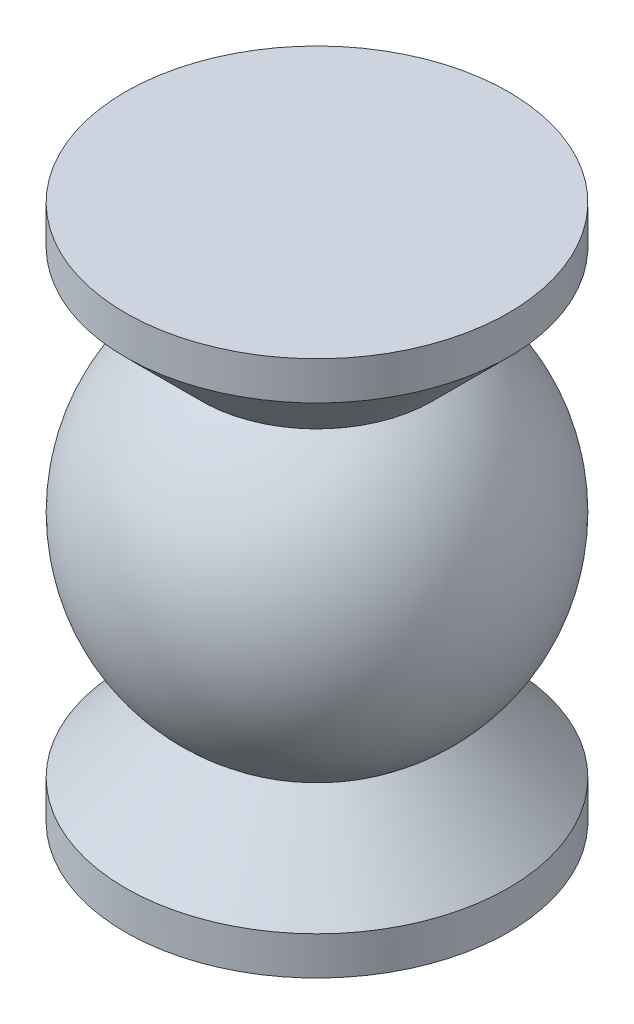
ISO-10303-21;
HEADER;
FILE_DESCRIPTION(('STEP AP214'),'2;1');
FILE_NAME('part.step','',(''),(''),'','','');
FILE_SCHEMA(('AUTOMOTIVE_DESIGN { 1 0 10303 214 1 1 1 1 }'));
ENDSEC;
DATA;
#1=APPLICATION_CONTEXT('core data for automotive mechanical design processes');
#2=APPLICATION_PROTOCOL_DEFINITION('international standard','automotive_design',2000,#1);
#3=PRODUCT_CONTEXT('',#1,'mechanical');
#4=PRODUCT('Part','Part','',(#3));
#5=PRODUCT_RELATED_PRODUCT_CATEGORY('part','',(#4));
#6=PRODUCT_DEFINITION_FORMATION('','',#4);
#7=PRODUCT_DEFINITION_CONTEXT('part definition',#1,'design');
#8=PRODUCT_DEFINITION('design','',#6,#7);
#9=PRODUCT_DEFINITION_SHAPE('','',#8);
#10=(LENGTH_UNIT() NAMED_UNIT(*) SI_UNIT(.MILLI.,.METRE.));
#11=(NAMED_UNIT(*) PLANE_ANGLE_UNIT() SI_UNIT($,.RADIAN.));
#12=(NAMED_UNIT(*) SI_UNIT($,.STERADIAN.) SOLID_ANGLE_UNIT());
#13=UNCERTAINTY_MEASURE_WITH_UNIT(LENGTH_MEASURE(1.E-05),#10,'distance_accuracy_value','');
#14=(GEOMETRIC_REPRESENTATION_CONTEXT(3) GLOBAL_UNCERTAINTY_ASSIGNED_CONTEXT((#13)) GLOBAL_UNIT_ASSIGNED_CONTEXT((#10,
#11,#12)) REPRESENTATION_CONTEXT('',''));
#15=CARTESIAN_POINT('',(0.,0.,0.));
#16=DIRECTION('',(0.,0.,1.));
#17=DIRECTION('',(1.,0.,0.));
#18=AXIS2_PLACEMENT_3D('',#15,#16,#17);
#19=CARTESIAN_POINT('',(0.,0.,0.));
#20=DIRECTION('',(0.,1.,0.));
#21=DIRECTION('',(1.,0.,0.));
#22=AXIS2_PLACEMENT_3D('',#19,#20,#21);
#23=SPHERICAL_SURFACE('',#22,25.);
#24=CARTESIAN_POINT('',(0.,20.,0.));
#25=DIRECTION('',(0.,1.,0.));
#26=DIRECTION('',(-1.,0.,0.));
#27=AXIS2_PLACEMENT_3D('',#24,#25,#26);
#28=CIRCLE('',#27,15.);
#29=CARTESIAN_POINT('',(15.,20.,0.));
#30=VERTEX_POINT('',#29);
#31=EDGE_CURVE('E10',#30,#30,#28,.T.);
#32=CARTESIAN_POINT('',(0.,-20.,0.));
#33=DIRECTION('',(0.,1.,0.));
#34=DIRECTION('',(-1.,0.,0.));
#35=AXIS2_PLACEMENT_3D('',#32,#33,#34);
#36=CIRCLE('',#35,15.);
#37=CARTESIAN_POINT('',(15.,-20.,0.));
#38=VERTEX_POINT('',#37);
#39=EDGE_CURVE('E56',#38,#38,#36,.T.);
#40=CARTESIAN_POINT('',(15.,20.,0.));
#41=CARTESIAN_POINT('',(15.386383877575,19.7102331585328,0.));
#42=CARTESIAN_POINT('',(15.764349304277,19.4092445387064,0.));
#43=CARTESIAN_POINT('',(16.5022218904126,18.785891059142,0.));
#44=CARTESIAN_POINT('',(16.8621290498462,18.4635261994041,0.));
#45=CARTESIAN_POINT('',(17.5626637359227,17.7984875568239,0.));
#46=CARTESIAN_POINT('',(17.9032912625656,17.4558137739817,0.));
#47=CARTESIAN_POINT('',(18.5641263057405,16.751312031891,0.));
#48=CARTESIAN_POINT('',(18.8843338222726,16.3894840726425,0.));
#49=CARTESIAN_POINT('',(19.5032526836538,15.6478878896459,0.));
#50=CARTESIAN_POINT('',(19.8019640285029,15.2681196658977,0.));
#51=CARTESIAN_POINT('',(20.3768877346255,14.4919184892619,0.));
#52=CARTESIAN_POINT('',(20.6531000958988,14.0954855363742,0.));
#53=CARTESIAN_POINT('',(21.1820982609088,13.2872860261715,0.));
#54=CARTESIAN_POINT('',(21.4348840646454,12.8755194688565,0.));
#55=CARTESIAN_POINT('',(21.9161802896365,12.0380354631662,0.));
#56=CARTESIAN_POINT('',(22.1446907108911,11.6123180147909,0.));
#57=CARTESIAN_POINT('',(22.5766688391047,10.748361760207,0.));
#58=CARTESIAN_POINT('',(22.7801365460637,10.3101229539983,0.));
#59=CARTESIAN_POINT('',(23.1613460121235,9.42259557021362,0.));
#60=CARTESIAN_POINT('',(23.3390877712243,8.97330699263761,0.));
#61=CARTESIAN_POINT('',(23.6682484928968,8.06518875528101,0.));
#62=CARTESIAN_POINT('',(23.8196674554685,7.60635909550043,0.));
#63=CARTESIAN_POINT('',(24.0956741265362,6.6806994219065,0.));
#64=CARTESIAN_POINT('',(24.2202618350321,6.21386940809315,0.));
#65=CARTESIAN_POINT('',(24.4421876383544,5.27377661927491,0.));
#66=CARTESIAN_POINT('',(24.5395257331807,4.80051384427002,0.));
#67=CARTESIAN_POINT('',(24.7066254525011,3.84914472685123,0.));
#68=CARTESIAN_POINT('',(24.7763870769951,3.37103838443732,0.));
#69=CARTESIAN_POINT('',(24.8880995994487,2.41158759044098,0.));
#70=CARTESIAN_POINT('',(24.9300504974084,1.93024313885855,0.));
#71=CARTESIAN_POINT('',(24.9860006976841,0.965932458184079,0.));
#72=CARTESIAN_POINT('',(25.,0.482966229092038,0.));
#73=CARTESIAN_POINT('',(25.,-0.482966229092043,0.));
#74=CARTESIAN_POINT('',(24.9860006976841,-0.965932458184084,0.));
#75=CARTESIAN_POINT('',(24.9300504974084,-1.93024313885856,0.));
#76=CARTESIAN_POINT('',(24.8880995994487,-2.41158759044099,0.));
#77=CARTESIAN_POINT('',(24.7763870769951,-3.37103838443733,0.));
#78=CARTESIAN_POINT('',(24.7066254525011,-3.84914472685123,0.));
#79=CARTESIAN_POINT('',(24.5395257331807,-4.80051384427003,0.));
#80=CARTESIAN_POINT('',(24.4421876383544,-5.27377661927491,0.));
#81=CARTESIAN_POINT('',(24.2202618350321,-6.21386940809315,0.));
#82=CARTESIAN_POINT('',(24.0956741265362,-6.68069942190651,0.));
#83=CARTESIAN_POINT('',(23.8196674554685,-7.60635909550044,0.));
#84=CARTESIAN_POINT('',(23.6682484928968,-8.06518875528102,0.));
#85=CARTESIAN_POINT('',(23.3390877712243,-8.97330699263762,0.));
#86=CARTESIAN_POINT('',(23.1613460121235,-9.42259557021363,0.));
#87=CARTESIAN_POINT('',(22.7801365460637,-10.3101229539983,0.));
#88=CARTESIAN_POINT('',(22.5766688391047,-10.748361760207,0.));
#89=CARTESIAN_POINT('',(22.1446907108911,-11.6123180147909,0.));
#90=CARTESIAN_POINT('',(21.9161802896365,-12.0380354631662,0.));
#91=CARTESIAN_POINT('',(21.4348840646454,-12.8755194688565,0.));
#92=CARTESIAN_POINT('',(21.1820982609088,-13.2872860261715,0.));
#93=CARTESIAN_POINT('',(20.6531000958988,-14.0954855363742,0.));
#94=CARTESIAN_POINT('',(20.3768877346255,-14.4919184892619,0.));
#95=CARTESIAN_POINT('',(19.8019640285029,-15.2681196658977,0.));
#96=CARTESIAN_POINT('',(19.5032526836538,-15.6478878896459,0.));
#97=CARTESIAN_POINT('',(18.8843338222726,-16.3894840726425,0.));
#98=CARTESIAN_POINT('',(18.5641263057405,-16.751312031891,0.));
#99=CARTESIAN_POINT('',(17.9032912625656,-17.4558137739817,0.));
#100=CARTESIAN_POINT('',(17.5626637359227,-17.7984875568239,0.));
#101=CARTESIAN_POINT('',(16.8621290498462,-18.4635261994041,0.));
#102=CARTESIAN_POINT('',(16.5022218904126,-18.785891059142,0.));
#103=CARTESIAN_POINT('',(15.764349304277,-19.4092445387064,0.));
#104=CARTESIAN_POINT('',(15.386383877575,-19.7102331585328,0.));
#105=CARTESIAN_POINT('',(15.,-20.,0.));
#106=B_SPLINE_CURVE_WITH_KNOTS('',3,(#40,#41,#42,#43,#44,#45,#46,#47,#48,#49,#50,#51,#52,#53,
#54,#55,#56,#57,#58,#59,#60,#61,#62,#63,#64,#65,#66,#67,#68,#69,#70,#71,#72,#73,#74,#75,#76,#77,
#78,#79,#80,#81,#82,#83,#84,#85,#86,#87,#88,#89,#90,#91,#92,#93,#94,#95,#96,#97,#98,#99,#100,
#101,#102,#103,#104,#105),.UNSPECIFIED.,.F.,.F.,(4,2,2,2,2,2,2,2,2,2,2,2,2,2,2,2,2,2,2,2,2,2,2,
2,2,2,2,2,2,2,2,2,4),(0.,1.4486960076868,2.89739201537359,4.34608802306039,5.79478403074719,
7.24348003843398,8.69217604612078,10.1408720538076,11.5895680614944,13.0382640691812,
14.486960076868,15.9356560845548,17.3843520922416,18.8330480999284,20.2817441076152,
21.730440115302,23.1791361229888,24.6278321306756,26.0765281383623,27.5252241460491,
28.9739201537359,30.4226161614227,31.8713121691095,33.3200081767963,34.7687041844831,
36.2174001921699,37.6660961998567,39.1147922075435,40.5634882152303,42.0121842229171,
43.4608802306039,44.9095762382907,46.3582722459775),.UNSPECIFIED.);
#107=EDGE_CURVE('BSEAM34',#30,#38,#106,.T.);
#108=ORIENTED_EDGE('',*,*,#31,.F.);
#109=ORIENTED_EDGE('',*,*,#39,.T.);
#110=ORIENTED_EDGE('',*,*,#107,.T.);
#111=ORIENTED_EDGE('',*,*,#107,.F.);
#112=EDGE_LOOP('',(#108,#110,#109,#111));
#113=FACE_BOUND('',#112,.T.);
#114=ADVANCED_FACE('F34',(#113),#23,.T.);
#115=CARTESIAN_POINT('',(0.,20.,0.));
#116=DIRECTION('',(0.,1.,0.));
#117=DIRECTION('',(-1.,0.,0.));
#118=AXIS2_PLACEMENT_3D('',#115,#116,#117);
#119=CONICAL_SURFACE('',#118,15.,0.785398163397448);
#120=CARTESIAN_POINT('',(0.,30.,0.));
#121=DIRECTION('',(0.,1.,0.));
#122=DIRECTION('',(-1.,0.,0.));
#123=AXIS2_PLACEMENT_3D('',#120,#121,#122);
#124=CIRCLE('',#123,25.);
#125=CARTESIAN_POINT('',(-25.,30.,0.));
#126=VERTEX_POINT('',#125);
#127=EDGE_CURVE('E40',#126,#126,#124,.T.);
#128=ORIENTED_EDGE('',*,*,#127,.F.);
#129=EDGE_LOOP('',(#128));
#130=FACE_BOUND('',#129,.T.);
#131=ORIENTED_EDGE('',*,*,#31,.T.);
#132=EDGE_LOOP('',(#131));
#133=FACE_BOUND('',#132,.T.);
#134=ADVANCED_FACE('F84',(#130,#133),#119,.T.);
#135=CARTESIAN_POINT('',(0.,35.,0.));
#136=DIRECTION('',(0.,1.,0.));
#137=DIRECTION('',(-1.,0.,0.));
#138=AXIS2_PLACEMENT_3D('',#135,#136,#137);
#139=CYLINDRICAL_SURFACE('',#138,25.);
#140=CARTESIAN_POINT('',(0.,35.,0.));
#141=DIRECTION('',(0.,1.,0.));
#142=DIRECTION('',(-1.,0.,0.));
#143=AXIS2_PLACEMENT_3D('',#140,#141,#142);
#144=CIRCLE('',#143,25.);
#145=CARTESIAN_POINT('',(-25.,35.,0.));
#146=VERTEX_POINT('',#145);
#147=EDGE_CURVE('E44',#146,#146,#144,.T.);
#148=ORIENTED_EDGE('',*,*,#147,.F.);
#149=EDGE_LOOP('',(#148));
#150=FACE_BOUND('',#149,.T.);
#151=ORIENTED_EDGE('',*,*,#127,.T.);
#152=EDGE_LOOP('',(#151));
#153=FACE_BOUND('',#152,.T.);
#154=ADVANCED_FACE('F80',(#150,#153),#139,.T.);
#155=CARTESIAN_POINT('',(25.,35.,0.));
#156=DIRECTION('',(0.,-1.,0.));
#157=DIRECTION('',(1.,0.,0.));
#158=AXIS2_PLACEMENT_3D('',#155,#156,#157);
#159=PLANE('',#158);
#160=ORIENTED_EDGE('',*,*,#147,.T.);
#161=EDGE_LOOP('',(#160));
#162=FACE_BOUND('',#161,.T.);
#163=ADVANCED_FACE('F75',(#162),#159,.F.);
#164=CARTESIAN_POINT('',(0.,-35.,0.));
#165=DIRECTION('',(0.,1.,0.));
#166=DIRECTION('',(-1.,0.,0.));
#167=AXIS2_PLACEMENT_3D('',#164,#165,#166);
#168=PLANE('',#167);
#169=CARTESIAN_POINT('',(0.,-35.,0.));
#170=DIRECTION('',(0.,1.,0.));
#171=DIRECTION('',(-1.,0.,0.));
#172=AXIS2_PLACEMENT_3D('',#169,#170,#171);
#173=CIRCLE('',#172,25.);
#174=CARTESIAN_POINT('',(-25.,-35.,0.));
#175=VERTEX_POINT('',#174);
#176=EDGE_CURVE('E48',#175,#175,#173,.T.);
#177=ORIENTED_EDGE('',*,*,#176,.F.);
#178=EDGE_LOOP('',(#177));
#179=FACE_BOUND('',#178,.T.);
#180=ADVANCED_FACE('F70',(#179),#168,.F.);
#181=CARTESIAN_POINT('',(0.,35.,0.));
#182=DIRECTION('',(0.,1.,0.));
#183=DIRECTION('',(-1.,0.,0.));
#184=AXIS2_PLACEMENT_3D('',#181,#182,#183);
#185=CYLINDRICAL_SURFACE('',#184,25.);
#186=CARTESIAN_POINT('',(0.,-30.,0.));
#187=DIRECTION('',(0.,1.,0.));
#188=DIRECTION('',(-1.,0.,0.));
#189=AXIS2_PLACEMENT_3D('',#186,#187,#188);
#190=CIRCLE('',#189,25.);
#191=CARTESIAN_POINT('',(-25.,-30.,0.));
#192=VERTEX_POINT('',#191);
#193=EDGE_CURVE('E53',#192,#192,#190,.T.);
#194=ORIENTED_EDGE('',*,*,#193,.F.);
#195=EDGE_LOOP('',(#194));
#196=FACE_BOUND('',#195,.T.);
#197=ORIENTED_EDGE('',*,*,#176,.T.);
#198=EDGE_LOOP('',(#197));
#199=FACE_BOUND('',#198,.T.);
#200=ADVANCED_FACE('F64',(#196,#199),#185,.T.);
#201=CARTESIAN_POINT('',(0.,-30.,0.));
#202=DIRECTION('',(0.,-1.,0.));
#203=DIRECTION('',(1.,0.,0.));
#204=AXIS2_PLACEMENT_3D('',#201,#202,#203);
#205=CONICAL_SURFACE('',#204,25.,0.785398163397449);
#206=ORIENTED_EDGE('',*,*,#39,.F.);
#207=EDGE_LOOP('',(#206));
#208=FACE_BOUND('',#207,.T.);
#209=ORIENTED_EDGE('',*,*,#193,.T.);
#210=EDGE_LOOP('',(#209));
#211=FACE_BOUND('',#210,.T.);
#212=ADVANCED_FACE('F61',(#208,#211),#205,.T.);
#213=CLOSED_SHELL('',(#114,#134,#154,#163,#180,#200,#212));
#214=MANIFOLD_SOLID_BREP('B2',#213);
#215=ADVANCED_BREP_SHAPE_REPRESENTATION('',(#18,#214),#14);
#216=SHAPE_DEFINITION_REPRESENTATION(#9,#215);
ENDSEC;
END-ISO-10303-21;
